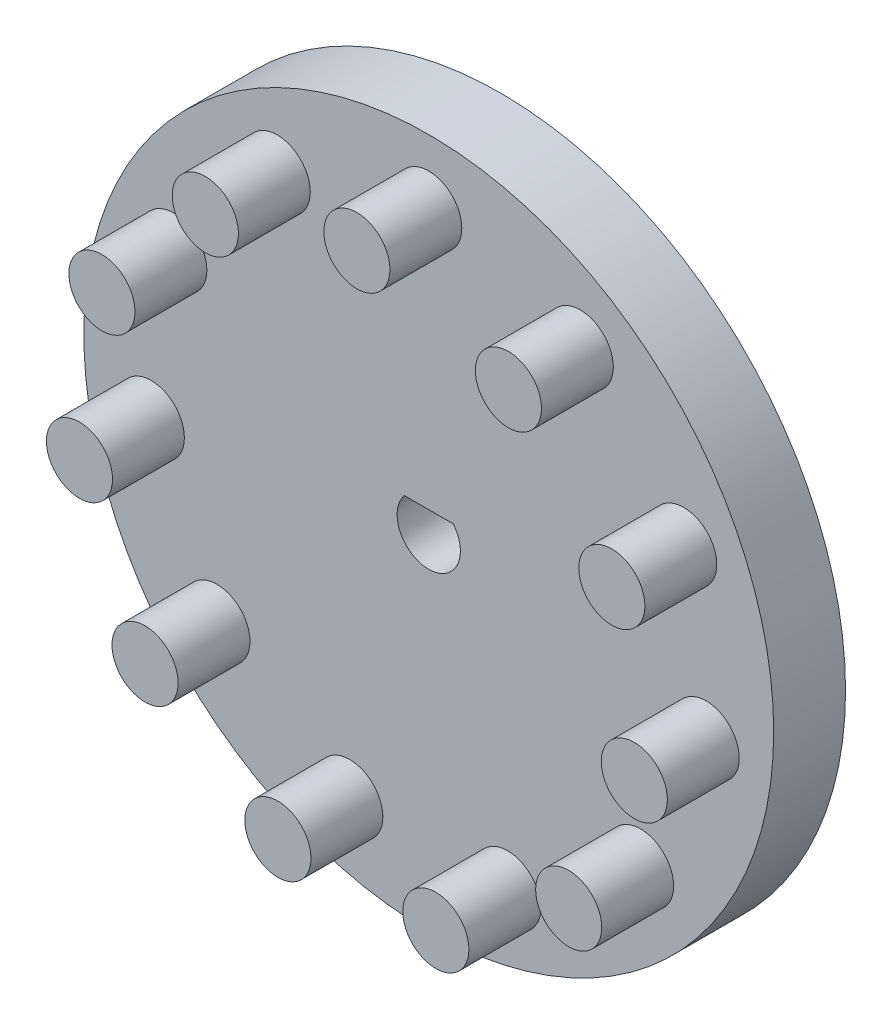
ISO-10303-21;
HEADER;
FILE_DESCRIPTION(('STEP AP214'),'2;1');
FILE_NAME('part.step','',(''),(''),'','','');
FILE_SCHEMA(('AUTOMOTIVE_DESIGN { 1 0 10303 214 1 1 1 1 }'));
ENDSEC;
DATA;
#1=APPLICATION_CONTEXT('core data for automotive mechanical design processes');
#2=APPLICATION_PROTOCOL_DEFINITION('international standard','automotive_design',2000,#1);
#3=PRODUCT_CONTEXT('',#1,'mechanical');
#4=PRODUCT('Part','Part','',(#3));
#5=PRODUCT_RELATED_PRODUCT_CATEGORY('part','',(#4));
#6=PRODUCT_DEFINITION_FORMATION('','',#4);
#7=PRODUCT_DEFINITION_CONTEXT('part definition',#1,'design');
#8=PRODUCT_DEFINITION('design','',#6,#7);
#9=PRODUCT_DEFINITION_SHAPE('','',#8);
#10=(LENGTH_UNIT() NAMED_UNIT(*) SI_UNIT(.MILLI.,.METRE.));
#11=(NAMED_UNIT(*) PLANE_ANGLE_UNIT() SI_UNIT($,.RADIAN.));
#12=(NAMED_UNIT(*) SI_UNIT($,.STERADIAN.) SOLID_ANGLE_UNIT());
#13=UNCERTAINTY_MEASURE_WITH_UNIT(LENGTH_MEASURE(1.E-05),#10,'distance_accuracy_value','');
#14=(GEOMETRIC_REPRESENTATION_CONTEXT(3) GLOBAL_UNCERTAINTY_ASSIGNED_CONTEXT((#13)) GLOBAL_UNIT_ASSIGNED_CONTEXT((#10,
#11,#12)) REPRESENTATION_CONTEXT('',''));
#15=CARTESIAN_POINT('',(0.,0.,0.));
#16=DIRECTION('',(0.,0.,1.));
#17=DIRECTION('',(1.,0.,0.));
#18=AXIS2_PLACEMENT_3D('',#15,#16,#17);
#19=CARTESIAN_POINT('',(0.,0.,3.175));
#20=DIRECTION('',(0.,0.,1.));
#21=DIRECTION('',(1.,0.,0.));
#22=AXIS2_PLACEMENT_3D('',#19,#20,#21);
#23=PLANE('',#22);
#24=CARTESIAN_POINT('',(-11.2635181824773,5.14387639849599,3.175));
#25=DIRECTION('',(0.,0.,1.));
#26=DIRECTION('',(1.,0.,0.));
#27=AXIS2_PLACEMENT_3D('',#24,#25,#26);
#28=CIRCLE('',#27,1.4605);
#29=CARTESIAN_POINT('',(-9.80301818247726,5.14387639849599,3.175));
#30=VERTEX_POINT('',#29);
#31=EDGE_CURVE('E205',#30,#30,#28,.F.);
#32=ORIENTED_EDGE('',*,*,#31,.T.);
#33=EDGE_LOOP('',(#32));
#34=FACE_BOUND('',#33,.T.);
#35=CARTESIAN_POINT('',(-9.35806910444168,-8.10881303807741,3.175));
#36=DIRECTION('',(0.,0.,1.));
#37=DIRECTION('',(1.,0.,0.));
#38=AXIS2_PLACEMENT_3D('',#35,#36,#37);
#39=CIRCLE('',#38,1.4605);
#40=CARTESIAN_POINT('',(-7.89756910444168,-8.10881303807741,3.175));
#41=VERTEX_POINT('',#40);
#42=EDGE_CURVE('E217',#41,#41,#39,.F.);
#43=ORIENTED_EDGE('',*,*,#42,.T.);
#44=EDGE_LOOP('',(#43));
#45=FACE_BOUND('',#44,.T.);
#46=CARTESIAN_POINT('',(3.48855338508892,-11.8809217457815,3.175));
#47=DIRECTION('',(0.,0.,1.));
#48=DIRECTION('',(1.,0.,0.));
#49=AXIS2_PLACEMENT_3D('',#46,#47,#48);
#50=CIRCLE('',#49,1.4605);
#51=CARTESIAN_POINT('',(4.94905338508892,-11.8809217457815,3.175));
#52=VERTEX_POINT('',#51);
#53=EDGE_CURVE('E229',#52,#52,#50,.F.);
#54=ORIENTED_EDGE('',*,*,#53,.T.);
#55=EDGE_LOOP('',(#54));
#56=FACE_BOUND('',#55,.T.);
#57=CARTESIAN_POINT('',(12.2564640040906,-1.762213484919,3.175));
#58=DIRECTION('',(0.,0.,1.));
#59=DIRECTION('',(1.,0.,0.));
#60=AXIS2_PLACEMENT_3D('',#57,#58,#59);
#61=CIRCLE('',#60,1.4605);
#62=CARTESIAN_POINT('',(13.7169640040906,-1.762213484919,3.175));
#63=VERTEX_POINT('',#62);
#64=EDGE_CURVE('E241',#63,#63,#61,.F.);
#65=ORIENTED_EDGE('',*,*,#64,.T.);
#66=EDGE_LOOP('',(#65));
#67=FACE_BOUND('',#66,.T.);
#68=CARTESIAN_POINT('',(6.69448492214395,10.4168218702821,3.175));
#69=DIRECTION('',(0.,0.,1.));
#70=DIRECTION('',(1.,0.,0.));
#71=AXIS2_PLACEMENT_3D('',#68,#69,#70);
#72=CIRCLE('',#71,1.4605);
#73=CARTESIAN_POINT('',(8.15498492214395,10.4168218702821,3.175));
#74=VERTEX_POINT('',#73);
#75=EDGE_CURVE('E78',#74,#74,#72,.F.);
#76=ORIENTED_EDGE('',*,*,#75,.T.);
#77=EDGE_LOOP('',(#76));
#78=FACE_BOUND('',#77,.T.);
#79=CARTESIAN_POINT('',(0.,12.3825,3.175));
#80=DIRECTION('',(0.,0.,1.));
#81=DIRECTION('',(1.,0.,0.));
#82=AXIS2_PLACEMENT_3D('',#79,#80,#81);
#83=CIRCLE('',#82,1.4605);
#84=CARTESIAN_POINT('',(1.4605,12.3825,3.175));
#85=VERTEX_POINT('',#84);
#86=EDGE_CURVE('E72',#85,#85,#83,.T.);
#87=ORIENTED_EDGE('',*,*,#86,.F.);
#88=EDGE_LOOP('',(#87));
#89=FACE_BOUND('',#88,.T.);
#90=CARTESIAN_POINT('',(0.,0.,3.175));
#91=DIRECTION('',(0.,0.,1.));
#92=DIRECTION('',(1.,0.,0.));
#93=AXIS2_PLACEMENT_3D('',#90,#91,#92);
#94=CIRCLE('',#93,15.24);
#95=CARTESIAN_POINT('',(15.24,0.,3.175));
#96=VERTEX_POINT('',#95);
#97=EDGE_CURVE('E11',#96,#96,#94,.T.);
#98=ORIENTED_EDGE('',*,*,#97,.T.);
#99=EDGE_LOOP('',(#98));
#100=FACE_BOUND('',#99,.T.);
#101=DIRECTION('',(-1.,0.,0.));
#102=VECTOR('',#101,1.);
#103=CARTESIAN_POINT('',(-1.0795,0.886729242779328,3.175));
#104=LINE('',#103,#102);
#105=CARTESIAN_POINT('',(1.0795,0.886729242779328,3.175));
#106=VERTEX_POINT('',#105);
#107=CARTESIAN_POINT('',(-1.0795,0.886729242779328,3.175));
#108=VERTEX_POINT('',#107);
#109=EDGE_CURVE('E81',#106,#108,#104,.T.);
#110=ORIENTED_EDGE('',*,*,#109,.F.);
#111=CARTESIAN_POINT('',(0.,0.,3.175));
#112=DIRECTION('',(0.,0.,1.));
#113=DIRECTION('',(1.,0.,0.));
#114=AXIS2_PLACEMENT_3D('',#111,#112,#113);
#115=CIRCLE('',#114,1.397);
#116=EDGE_CURVE('E67',#108,#106,#115,.T.);
#117=ORIENTED_EDGE('',*,*,#116,.F.);
#118=EDGE_LOOP('',(#110,#117));
#119=FACE_BOUND('',#118,.T.);
#120=CARTESIAN_POINT('',(11.2635181824773,5.14387639849583,3.175));
#121=DIRECTION('',(0.,0.,1.));
#122=DIRECTION('',(1.,0.,0.));
#123=AXIS2_PLACEMENT_3D('',#120,#121,#122);
#124=CIRCLE('',#123,1.4605);
#125=CARTESIAN_POINT('',(12.7240181824773,5.14387639849583,3.175));
#126=VERTEX_POINT('',#125);
#127=EDGE_CURVE('E247',#126,#126,#124,.F.);
#128=ORIENTED_EDGE('',*,*,#127,.T.);
#129=EDGE_LOOP('',(#128));
#130=FACE_BOUND('',#129,.T.);
#131=CARTESIAN_POINT('',(9.35806910444156,-8.10881303807754,3.175));
#132=DIRECTION('',(0.,0.,1.));
#133=DIRECTION('',(1.,0.,0.));
#134=AXIS2_PLACEMENT_3D('',#131,#132,#133);
#135=CIRCLE('',#134,1.4605);
#136=CARTESIAN_POINT('',(10.8185691044416,-8.10881303807754,3.175));
#137=VERTEX_POINT('',#136);
#138=EDGE_CURVE('E235',#137,#137,#135,.F.);
#139=ORIENTED_EDGE('',*,*,#138,.T.);
#140=EDGE_LOOP('',(#139));
#141=FACE_BOUND('',#140,.T.);
#142=CARTESIAN_POINT('',(-3.48855338508909,-11.8809217457815,3.175));
#143=DIRECTION('',(0.,0.,1.));
#144=DIRECTION('',(1.,0.,0.));
#145=AXIS2_PLACEMENT_3D('',#142,#143,#144);
#146=CIRCLE('',#145,1.4605);
#147=CARTESIAN_POINT('',(-2.02805338508909,-11.8809217457815,3.175));
#148=VERTEX_POINT('',#147);
#149=EDGE_CURVE('E223',#148,#148,#146,.F.);
#150=ORIENTED_EDGE('',*,*,#149,.T.);
#151=EDGE_LOOP('',(#150));
#152=FACE_BOUND('',#151,.T.);
#153=CARTESIAN_POINT('',(-12.2564640040907,-1.76221348491882,3.175));
#154=DIRECTION('',(0.,0.,1.));
#155=DIRECTION('',(1.,0.,0.));
#156=AXIS2_PLACEMENT_3D('',#153,#154,#155);
#157=CIRCLE('',#156,1.4605);
#158=CARTESIAN_POINT('',(-10.7959640040907,-1.76221348491882,3.175));
#159=VERTEX_POINT('',#158);
#160=EDGE_CURVE('E211',#159,#159,#157,.F.);
#161=ORIENTED_EDGE('',*,*,#160,.T.);
#162=EDGE_LOOP('',(#161));
#163=FACE_BOUND('',#162,.T.);
#164=CARTESIAN_POINT('',(-6.6944849221438,10.4168218702822,3.175));
#165=DIRECTION('',(0.,0.,1.));
#166=DIRECTION('',(1.,0.,0.));
#167=AXIS2_PLACEMENT_3D('',#164,#165,#166);
#168=CIRCLE('',#167,1.4605);
#169=CARTESIAN_POINT('',(-5.2339849221438,10.4168218702822,3.175));
#170=VERTEX_POINT('',#169);
#171=EDGE_CURVE('E197',#170,#170,#168,.F.);
#172=ORIENTED_EDGE('',*,*,#171,.T.);
#173=EDGE_LOOP('',(#172));
#174=FACE_BOUND('',#173,.T.);
#175=ADVANCED_FACE('F35',(#34,#45,#56,#67,#78,#89,#100,#119,#130,#141,#152,#163,#174),#23,.T.);
#176=CARTESIAN_POINT('',(0.,0.,0.));
#177=DIRECTION('',(0.,0.,1.));
#178=DIRECTION('',(1.,0.,0.));
#179=AXIS2_PLACEMENT_3D('',#176,#177,#178);
#180=PLANE('',#179);
#181=CARTESIAN_POINT('',(0.,0.,0.));
#182=DIRECTION('',(0.,0.,1.));
#183=DIRECTION('',(1.,0.,0.));
#184=AXIS2_PLACEMENT_3D('',#181,#182,#183);
#185=CIRCLE('',#184,15.24);
#186=CARTESIAN_POINT('',(15.24,0.,0.));
#187=VERTEX_POINT('',#186);
#188=EDGE_CURVE('E39',#187,#187,#185,.T.);
#189=ORIENTED_EDGE('',*,*,#188,.F.);
#190=EDGE_LOOP('',(#189));
#191=FACE_BOUND('',#190,.T.);
#192=CARTESIAN_POINT('',(0.,0.,0.));
#193=DIRECTION('',(0.,0.,1.));
#194=DIRECTION('',(1.,0.,0.));
#195=AXIS2_PLACEMENT_3D('',#192,#193,#194);
#196=CIRCLE('',#195,1.397);
#197=CARTESIAN_POINT('',(-1.0795,0.886729242779328,0.));
#198=VERTEX_POINT('',#197);
#199=CARTESIAN_POINT('',(1.0795,0.886729242779328,0.));
#200=VERTEX_POINT('',#199);
#201=EDGE_CURVE('E57',#198,#200,#196,.T.);
#202=ORIENTED_EDGE('',*,*,#201,.T.);
#203=DIRECTION('',(-1.,0.,0.));
#204=VECTOR('',#203,1.);
#205=CARTESIAN_POINT('',(-1.0795,0.886729242779328,0.));
#206=LINE('',#205,#204);
#207=EDGE_CURVE('E63',#200,#198,#206,.T.);
#208=ORIENTED_EDGE('',*,*,#207,.T.);
#209=EDGE_LOOP('',(#202,#208));
#210=FACE_BOUND('',#209,.T.);
#211=ADVANCED_FACE('F74',(#191,#210),#180,.F.);
#212=CARTESIAN_POINT('',(0.,0.,3.175));
#213=DIRECTION('',(0.,0.,-1.));
#214=DIRECTION('',(-1.,0.,0.));
#215=AXIS2_PLACEMENT_3D('',#212,#213,#214);
#216=CYLINDRICAL_SURFACE('',#215,15.24);
#217=ORIENTED_EDGE('',*,*,#97,.F.);
#218=EDGE_LOOP('',(#217));
#219=FACE_BOUND('',#218,.T.);
#220=ORIENTED_EDGE('',*,*,#188,.T.);
#221=EDGE_LOOP('',(#220));
#222=FACE_BOUND('',#221,.T.);
#223=ADVANCED_FACE('F37',(#219,#222),#216,.T.);
#224=CARTESIAN_POINT('',(0.,0.,3.175));
#225=DIRECTION('',(0.,0.,-1.));
#226=DIRECTION('',(-1.,0.,0.));
#227=AXIS2_PLACEMENT_3D('',#224,#225,#226);
#228=CYLINDRICAL_SURFACE('',#227,1.397);
#229=ORIENTED_EDGE('',*,*,#201,.F.);
#230=DIRECTION('',(0.,0.,-1.));
#231=VECTOR('',#230,1.);
#232=CARTESIAN_POINT('',(-1.0795,0.886729242779328,3.175));
#233=LINE('',#232,#231);
#234=EDGE_CURVE('E65',#108,#198,#233,.T.);
#235=ORIENTED_EDGE('',*,*,#234,.F.);
#236=ORIENTED_EDGE('',*,*,#116,.T.);
#237=DIRECTION('',(0.,0.,-1.));
#238=VECTOR('',#237,1.);
#239=CARTESIAN_POINT('',(1.0795,0.886729242779328,3.175));
#240=LINE('',#239,#238);
#241=EDGE_CURVE('E50',#106,#200,#240,.T.);
#242=ORIENTED_EDGE('',*,*,#241,.T.);
#243=EDGE_LOOP('',(#229,#235,#236,#242));
#244=FACE_BOUND('',#243,.T.);
#245=ADVANCED_FACE('F69',(#244),#228,.F.);
#246=CARTESIAN_POINT('',(-1.0795,0.886729242779328,3.175));
#247=DIRECTION('',(0.,-1.,0.));
#248=DIRECTION('',(0.,0.,-1.));
#249=AXIS2_PLACEMENT_3D('',#246,#247,#248);
#250=PLANE('',#249);
#251=ORIENTED_EDGE('',*,*,#207,.F.);
#252=ORIENTED_EDGE('',*,*,#241,.F.);
#253=ORIENTED_EDGE('',*,*,#109,.T.);
#254=ORIENTED_EDGE('',*,*,#234,.T.);
#255=EDGE_LOOP('',(#251,#252,#253,#254));
#256=FACE_BOUND('',#255,.T.);
#257=ADVANCED_FACE('F64',(#256),#250,.T.);
#258=CARTESIAN_POINT('',(0.,12.3825,6.35));
#259=DIRECTION('',(0.,0.,-1.));
#260=DIRECTION('',(-1.,0.,0.));
#261=AXIS2_PLACEMENT_3D('',#258,#259,#260);
#262=CYLINDRICAL_SURFACE('',#261,1.4605);
#263=ORIENTED_EDGE('',*,*,#86,.T.);
#264=EDGE_LOOP('',(#263));
#265=FACE_BOUND('',#264,.T.);
#266=CARTESIAN_POINT('',(0.,12.3825,6.35));
#267=DIRECTION('',(0.,0.,1.));
#268=DIRECTION('',(1.,0.,0.));
#269=AXIS2_PLACEMENT_3D('',#266,#267,#268);
#270=CIRCLE('',#269,1.4605);
#271=CARTESIAN_POINT('',(1.4605,12.3825,6.35));
#272=VERTEX_POINT('',#271);
#273=EDGE_CURVE('E75',#272,#272,#270,.T.);
#274=ORIENTED_EDGE('',*,*,#273,.F.);
#275=EDGE_LOOP('',(#274));
#276=FACE_BOUND('',#275,.T.);
#277=ADVANCED_FACE('F105',(#265,#276),#262,.T.);
#278=CARTESIAN_POINT('',(0.,0.,6.35));
#279=DIRECTION('',(0.,0.,1.));
#280=DIRECTION('',(1.,0.,0.));
#281=AXIS2_PLACEMENT_3D('',#278,#279,#280);
#282=PLANE('',#281);
#283=ORIENTED_EDGE('',*,*,#273,.T.);
#284=EDGE_LOOP('',(#283));
#285=FACE_BOUND('',#284,.T.);
#286=ADVANCED_FACE('F108',(#285),#282,.T.);
#287=CARTESIAN_POINT('',(6.69448492214395,10.4168218702821,6.35));
#288=DIRECTION('',(0.,0.,-1.));
#289=DIRECTION('',(-1.,0.,0.));
#290=AXIS2_PLACEMENT_3D('',#287,#288,#289);
#291=CYLINDRICAL_SURFACE('',#290,1.4605);
#292=ORIENTED_EDGE('',*,*,#75,.F.);
#293=EDGE_LOOP('',(#292));
#294=FACE_BOUND('',#293,.T.);
#295=CARTESIAN_POINT('',(6.69448492214395,10.4168218702821,6.35));
#296=DIRECTION('',(0.,0.,1.));
#297=DIRECTION('',(0.841253532831181,-0.540640817455599,0.));
#298=AXIS2_PLACEMENT_3D('',#295,#296,#297);
#299=CIRCLE('',#298,1.4605);
#300=CARTESIAN_POINT('',(7.92313570684389,9.62721595638819,6.35));
#301=VERTEX_POINT('',#300);
#302=EDGE_CURVE('E250',#301,#301,#299,.T.);
#303=ORIENTED_EDGE('',*,*,#302,.F.);
#304=EDGE_LOOP('',(#303));
#305=FACE_BOUND('',#304,.T.);
#306=ADVANCED_FACE('F111',(#294,#305),#291,.T.);
#307=CARTESIAN_POINT('',(0.,0.,6.35));
#308=DIRECTION('',(0.,0.,1.));
#309=DIRECTION('',(0.841253532831181,-0.540640817455599,0.));
#310=AXIS2_PLACEMENT_3D('',#307,#308,#309);
#311=PLANE('',#310);
#312=ORIENTED_EDGE('',*,*,#302,.T.);
#313=EDGE_LOOP('',(#312));
#314=FACE_BOUND('',#313,.T.);
#315=ADVANCED_FACE('F115',(#314),#311,.T.);
#316=CARTESIAN_POINT('',(11.2635181824773,5.14387639849583,6.35));
#317=DIRECTION('',(0.,0.,-1.));
#318=DIRECTION('',(-1.,0.,0.));
#319=AXIS2_PLACEMENT_3D('',#316,#317,#318);
#320=CYLINDRICAL_SURFACE('',#319,1.4605);
#321=ORIENTED_EDGE('',*,*,#127,.F.);
#322=EDGE_LOOP('',(#321));
#323=FACE_BOUND('',#322,.T.);
#324=CARTESIAN_POINT('',(11.2635181824773,5.14387639849583,6.35));
#325=DIRECTION('',(0.,0.,1.));
#326=DIRECTION('',(0.415415013001884,-0.909631995354519,0.));
#327=AXIS2_PLACEMENT_3D('',#324,#325,#326);
#328=CIRCLE('',#327,1.4605);
#329=CARTESIAN_POINT('',(11.8702318089666,3.81535886928055,6.35));
#330=VERTEX_POINT('',#329);
#331=EDGE_CURVE('E244',#330,#330,#328,.T.);
#332=ORIENTED_EDGE('',*,*,#331,.F.);
#333=EDGE_LOOP('',(#332));
#334=FACE_BOUND('',#333,.T.);
#335=ADVANCED_FACE('F119',(#323,#334),#320,.T.);
#336=CARTESIAN_POINT('',(0.,0.,6.35));
#337=DIRECTION('',(0.,0.,1.));
#338=DIRECTION('',(0.415415013001884,-0.909631995354519,0.));
#339=AXIS2_PLACEMENT_3D('',#336,#337,#338);
#340=PLANE('',#339);
#341=ORIENTED_EDGE('',*,*,#331,.T.);
#342=EDGE_LOOP('',(#341));
#343=FACE_BOUND('',#342,.T.);
#344=ADVANCED_FACE('F123',(#343),#340,.T.);
#345=CARTESIAN_POINT('',(12.2564640040906,-1.762213484919,6.35));
#346=DIRECTION('',(0.,0.,-1.));
#347=DIRECTION('',(-1.,0.,0.));
#348=AXIS2_PLACEMENT_3D('',#345,#346,#347);
#349=CYLINDRICAL_SURFACE('',#348,1.4605);
#350=ORIENTED_EDGE('',*,*,#64,.F.);
#351=EDGE_LOOP('',(#350));
#352=FACE_BOUND('',#351,.T.);
#353=CARTESIAN_POINT('',(12.2564640040906,-1.762213484919,6.35));
#354=DIRECTION('',(0.,0.,1.));
#355=DIRECTION('',(-0.142314838273289,-0.989821441880932,0.));
#356=AXIS2_PLACEMENT_3D('',#353,#354,#355);
#357=CIRCLE('',#356,1.4605);
#358=CARTESIAN_POINT('',(12.0486131827925,-3.2078477007861,6.35));
#359=VERTEX_POINT('',#358);
#360=EDGE_CURVE('E238',#359,#359,#357,.T.);
#361=ORIENTED_EDGE('',*,*,#360,.F.);
#362=EDGE_LOOP('',(#361));
#363=FACE_BOUND('',#362,.T.);
#364=ADVANCED_FACE('F127',(#352,#363),#349,.T.);
#365=CARTESIAN_POINT('',(0.,0.,6.35));
#366=DIRECTION('',(0.,0.,1.));
#367=DIRECTION('',(-0.142314838273289,-0.989821441880932,0.));
#368=AXIS2_PLACEMENT_3D('',#365,#366,#367);
#369=PLANE('',#368);
#370=ORIENTED_EDGE('',*,*,#360,.T.);
#371=EDGE_LOOP('',(#370));
#372=FACE_BOUND('',#371,.T.);
#373=ADVANCED_FACE('F131',(#372),#369,.T.);
#374=CARTESIAN_POINT('',(9.35806910444156,-8.10881303807754,6.35));
#375=DIRECTION('',(0.,0.,-1.));
#376=DIRECTION('',(-1.,0.,0.));
#377=AXIS2_PLACEMENT_3D('',#374,#375,#376);
#378=CYLINDRICAL_SURFACE('',#377,1.4605);
#379=ORIENTED_EDGE('',*,*,#138,.F.);
#380=EDGE_LOOP('',(#379));
#381=FACE_BOUND('',#380,.T.);
#382=CARTESIAN_POINT('',(9.35806910444156,-8.10881303807754,6.35));
#383=DIRECTION('',(0.,0.,1.));
#384=DIRECTION('',(-0.654860733945289,-0.755749574354255,0.));
#385=AXIS2_PLACEMENT_3D('',#382,#383,#384);
#386=CIRCLE('',#385,1.4605);
#387=CARTESIAN_POINT('',(8.40164500251447,-9.21258529142193,6.35));
#388=VERTEX_POINT('',#387);
#389=EDGE_CURVE('E232',#388,#388,#386,.T.);
#390=ORIENTED_EDGE('',*,*,#389,.F.);
#391=EDGE_LOOP('',(#390));
#392=FACE_BOUND('',#391,.T.);
#393=ADVANCED_FACE('F135',(#381,#392),#378,.T.);
#394=CARTESIAN_POINT('',(0.,0.,6.35));
#395=DIRECTION('',(0.,0.,1.));
#396=DIRECTION('',(-0.654860733945289,-0.755749574354255,0.));
#397=AXIS2_PLACEMENT_3D('',#394,#395,#396);
#398=PLANE('',#397);
#399=ORIENTED_EDGE('',*,*,#389,.T.);
#400=EDGE_LOOP('',(#399));
#401=FACE_BOUND('',#400,.T.);
#402=ADVANCED_FACE('F139',(#401),#398,.T.);
#403=CARTESIAN_POINT('',(3.48855338508892,-11.8809217457815,6.35));
#404=DIRECTION('',(0.,0.,-1.));
#405=DIRECTION('',(-1.,0.,0.));
#406=AXIS2_PLACEMENT_3D('',#403,#404,#405);
#407=CYLINDRICAL_SURFACE('',#406,1.4605);
#408=ORIENTED_EDGE('',*,*,#53,.F.);
#409=EDGE_LOOP('',(#408));
#410=FACE_BOUND('',#409,.T.);
#411=CARTESIAN_POINT('',(3.48855338508892,-11.8809217457815,6.35));
#412=DIRECTION('',(0.,0.,1.));
#413=DIRECTION('',(-0.959492973614499,-0.281732556841423,0.));
#414=AXIS2_PLACEMENT_3D('',#411,#412,#413);
#415=CIRCLE('',#414,1.4605);
#416=CARTESIAN_POINT('',(2.08721389712495,-12.2923921450484,6.35));
#417=VERTEX_POINT('',#416);
#418=EDGE_CURVE('E226',#417,#417,#415,.T.);
#419=ORIENTED_EDGE('',*,*,#418,.F.);
#420=EDGE_LOOP('',(#419));
#421=FACE_BOUND('',#420,.T.);
#422=ADVANCED_FACE('F143',(#410,#421),#407,.T.);
#423=CARTESIAN_POINT('',(0.,0.,6.35));
#424=DIRECTION('',(0.,0.,1.));
#425=DIRECTION('',(-0.959492973614499,-0.281732556841423,0.));
#426=AXIS2_PLACEMENT_3D('',#423,#424,#425);
#427=PLANE('',#426);
#428=ORIENTED_EDGE('',*,*,#418,.T.);
#429=EDGE_LOOP('',(#428));
#430=FACE_BOUND('',#429,.T.);
#431=ADVANCED_FACE('F147',(#430),#427,.T.);
#432=CARTESIAN_POINT('',(-3.48855338508909,-11.8809217457815,6.35));
#433=DIRECTION('',(0.,0.,-1.));
#434=DIRECTION('',(-1.,0.,0.));
#435=AXIS2_PLACEMENT_3D('',#432,#433,#434);
#436=CYLINDRICAL_SURFACE('',#435,1.4605);
#437=ORIENTED_EDGE('',*,*,#149,.F.);
#438=EDGE_LOOP('',(#437));
#439=FACE_BOUND('',#438,.T.);
#440=CARTESIAN_POINT('',(-3.48855338508909,-11.8809217457815,6.35));
#441=DIRECTION('',(0.,0.,1.));
#442=DIRECTION('',(-0.959492973614495,0.281732556841437,0.));
#443=AXIS2_PLACEMENT_3D('',#440,#441,#442);
#444=CIRCLE('',#443,1.4605);
#445=CARTESIAN_POINT('',(-4.88989287305307,-11.4694513465146,6.35));
#446=VERTEX_POINT('',#445);
#447=EDGE_CURVE('E220',#446,#446,#444,.T.);
#448=ORIENTED_EDGE('',*,*,#447,.F.);
#449=EDGE_LOOP('',(#448));
#450=FACE_BOUND('',#449,.T.);
#451=ADVANCED_FACE('F151',(#439,#450),#436,.T.);
#452=CARTESIAN_POINT('',(0.,0.,6.35));
#453=DIRECTION('',(0.,0.,1.));
#454=DIRECTION('',(-0.959492973614495,0.281732556841437,0.));
#455=AXIS2_PLACEMENT_3D('',#452,#453,#454);
#456=PLANE('',#455);
#457=ORIENTED_EDGE('',*,*,#447,.T.);
#458=EDGE_LOOP('',(#457));
#459=FACE_BOUND('',#458,.T.);
#460=ADVANCED_FACE('F155',(#459),#456,.T.);
#461=CARTESIAN_POINT('',(-9.35806910444168,-8.10881303807741,6.35));
#462=DIRECTION('',(0.,0.,-1.));
#463=DIRECTION('',(-1.,0.,0.));
#464=AXIS2_PLACEMENT_3D('',#461,#462,#463);
#465=CYLINDRICAL_SURFACE('',#464,1.4605);
#466=ORIENTED_EDGE('',*,*,#42,.F.);
#467=EDGE_LOOP('',(#466));
#468=FACE_BOUND('',#467,.T.);
#469=CARTESIAN_POINT('',(-9.35806910444168,-8.10881303807741,6.35));
#470=DIRECTION('',(0.,0.,1.));
#471=DIRECTION('',(-0.654860733945278,0.755749574354264,0.));
#472=AXIS2_PLACEMENT_3D('',#469,#470,#471);
#473=CIRCLE('',#472,1.4605);
#474=CARTESIAN_POINT('',(-10.3144932063688,-7.005040784733,6.35));
#475=VERTEX_POINT('',#474);
#476=EDGE_CURVE('E214',#475,#475,#473,.T.);
#477=ORIENTED_EDGE('',*,*,#476,.F.);
#478=EDGE_LOOP('',(#477));
#479=FACE_BOUND('',#478,.T.);
#480=ADVANCED_FACE('F159',(#468,#479),#465,.T.);
#481=CARTESIAN_POINT('',(0.,0.,6.35));
#482=DIRECTION('',(0.,0.,1.));
#483=DIRECTION('',(-0.654860733945278,0.755749574354264,0.));
#484=AXIS2_PLACEMENT_3D('',#481,#482,#483);
#485=PLANE('',#484);
#486=ORIENTED_EDGE('',*,*,#476,.T.);
#487=EDGE_LOOP('',(#486));
#488=FACE_BOUND('',#487,.T.);
#489=ADVANCED_FACE('F163',(#488),#485,.T.);
#490=CARTESIAN_POINT('',(-12.2564640040907,-1.76221348491882,6.35));
#491=DIRECTION('',(0.,0.,-1.));
#492=DIRECTION('',(-1.,0.,0.));
#493=AXIS2_PLACEMENT_3D('',#490,#491,#492);
#494=CYLINDRICAL_SURFACE('',#493,1.4605);
#495=ORIENTED_EDGE('',*,*,#160,.F.);
#496=EDGE_LOOP('',(#495));
#497=FACE_BOUND('',#496,.T.);
#498=CARTESIAN_POINT('',(-12.2564640040907,-1.76221348491882,6.35));
#499=DIRECTION('',(0.,0.,1.));
#500=DIRECTION('',(-0.142314838273275,0.989821441880934,0.));
#501=AXIS2_PLACEMENT_3D('',#498,#499,#500);
#502=CIRCLE('',#501,1.4605);
#503=CARTESIAN_POINT('',(-12.4643148253888,-0.316579269051719,6.35));
#504=VERTEX_POINT('',#503);
#505=EDGE_CURVE('E208',#504,#504,#502,.T.);
#506=ORIENTED_EDGE('',*,*,#505,.F.);
#507=EDGE_LOOP('',(#506));
#508=FACE_BOUND('',#507,.T.);
#509=ADVANCED_FACE('F167',(#497,#508),#494,.T.);
#510=CARTESIAN_POINT('',(0.,0.,6.35));
#511=DIRECTION('',(0.,0.,1.));
#512=DIRECTION('',(-0.142314838273275,0.989821441880934,0.));
#513=AXIS2_PLACEMENT_3D('',#510,#511,#512);
#514=PLANE('',#513);
#515=ORIENTED_EDGE('',*,*,#505,.T.);
#516=EDGE_LOOP('',(#515));
#517=FACE_BOUND('',#516,.T.);
#518=ADVANCED_FACE('F171',(#517),#514,.T.);
#519=CARTESIAN_POINT('',(-11.2635181824773,5.14387639849599,6.35));
#520=DIRECTION('',(0.,0.,-1.));
#521=DIRECTION('',(-1.,0.,0.));
#522=AXIS2_PLACEMENT_3D('',#519,#520,#521);
#523=CYLINDRICAL_SURFACE('',#522,1.4605);
#524=ORIENTED_EDGE('',*,*,#31,.F.);
#525=EDGE_LOOP('',(#524));
#526=FACE_BOUND('',#525,.T.);
#527=CARTESIAN_POINT('',(-11.2635181824773,5.14387639849599,6.35));
#528=DIRECTION('',(0.,0.,1.));
#529=DIRECTION('',(0.415415013001897,0.909631995354513,0.));
#530=AXIS2_PLACEMENT_3D('',#527,#528,#529);
#531=CIRCLE('',#530,1.4605);
#532=CARTESIAN_POINT('',(-10.656804555988,6.47239392771126,6.35));
#533=VERTEX_POINT('',#532);
#534=EDGE_CURVE('E200',#533,#533,#531,.T.);
#535=ORIENTED_EDGE('',*,*,#534,.F.);
#536=EDGE_LOOP('',(#535));
#537=FACE_BOUND('',#536,.T.);
#538=ADVANCED_FACE('F175',(#526,#537),#523,.T.);
#539=CARTESIAN_POINT('',(0.,0.,6.35));
#540=DIRECTION('',(0.,0.,1.));
#541=DIRECTION('',(0.415415013001897,0.909631995354513,0.));
#542=AXIS2_PLACEMENT_3D('',#539,#540,#541);
#543=PLANE('',#542);
#544=ORIENTED_EDGE('',*,*,#534,.T.);
#545=EDGE_LOOP('',(#544));
#546=FACE_BOUND('',#545,.T.);
#547=ADVANCED_FACE('F179',(#546),#543,.T.);
#548=CARTESIAN_POINT('',(-6.6944849221438,10.4168218702822,6.35));
#549=DIRECTION('',(0.,0.,-1.));
#550=DIRECTION('',(-1.,0.,0.));
#551=AXIS2_PLACEMENT_3D('',#548,#549,#550);
#552=CYLINDRICAL_SURFACE('',#551,1.4605);
#553=ORIENTED_EDGE('',*,*,#171,.F.);
#554=EDGE_LOOP('',(#553));
#555=FACE_BOUND('',#554,.T.);
#556=CARTESIAN_POINT('',(-6.6944849221438,10.4168218702822,6.35));
#557=DIRECTION('',(0.,0.,1.));
#558=DIRECTION('',(0.841253532831188,0.540640817455586,0.));
#559=AXIS2_PLACEMENT_3D('',#556,#557,#558);
#560=CIRCLE('',#559,1.4605);
#561=CARTESIAN_POINT('',(-5.46583413744385,11.2064277841761,6.35));
#562=VERTEX_POINT('',#561);
#563=EDGE_CURVE('E195',#562,#562,#560,.T.);
#564=ORIENTED_EDGE('',*,*,#563,.F.);
#565=EDGE_LOOP('',(#564));
#566=FACE_BOUND('',#565,.T.);
#567=ADVANCED_FACE('F183',(#555,#566),#552,.T.);
#568=CARTESIAN_POINT('',(0.,0.,6.35));
#569=DIRECTION('',(0.,0.,1.));
#570=DIRECTION('',(0.841253532831188,0.540640817455586,0.));
#571=AXIS2_PLACEMENT_3D('',#568,#569,#570);
#572=PLANE('',#571);
#573=ORIENTED_EDGE('',*,*,#563,.T.);
#574=EDGE_LOOP('',(#573));
#575=FACE_BOUND('',#574,.T.);
#576=ADVANCED_FACE('F187',(#575),#572,.T.);
#577=CLOSED_SHELL('',(#175,#211,#223,#245,#257,#277,#286,#306,#315,#335,#344,#364,#373,#393,
#402,#422,#431,#451,#460,#480,#489,#509,#518,#538,#547,#567,#576));
#578=MANIFOLD_SOLID_BREP('B2',#577);
#579=ADVANCED_BREP_SHAPE_REPRESENTATION('',(#18,#578),#14);
#580=SHAPE_DEFINITION_REPRESENTATION(#9,#579);
ENDSEC;
END-ISO-10303-21;
